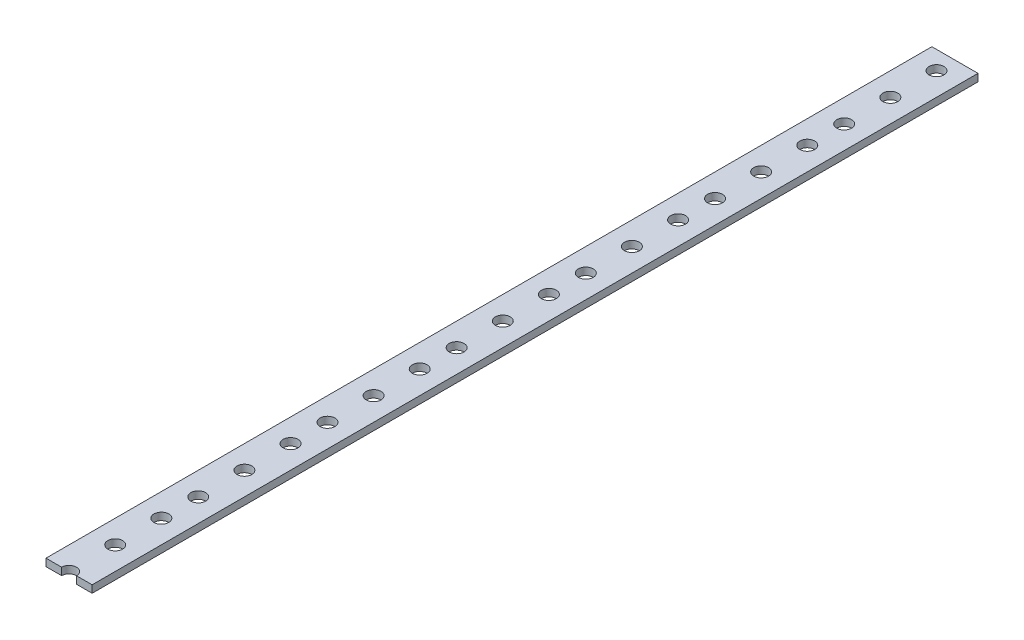
ISO-10303-21;
HEADER;
FILE_DESCRIPTION(('STEP AP214'),'2;1');
FILE_NAME('part.step','',(''),(''),'','','');
FILE_SCHEMA(('AUTOMOTIVE_DESIGN { 1 0 10303 214 1 1 1 1 }'));
ENDSEC;
DATA;
#1=APPLICATION_CONTEXT('core data for automotive mechanical design processes');
#2=APPLICATION_PROTOCOL_DEFINITION('international standard','automotive_design',2000,#1);
#3=PRODUCT_CONTEXT('',#1,'mechanical');
#4=PRODUCT('Part','Part','',(#3));
#5=PRODUCT_RELATED_PRODUCT_CATEGORY('part','',(#4));
#6=PRODUCT_DEFINITION_FORMATION('','',#4);
#7=PRODUCT_DEFINITION_CONTEXT('part definition',#1,'design');
#8=PRODUCT_DEFINITION('design','',#6,#7);
#9=PRODUCT_DEFINITION_SHAPE('','',#8);
#10=(LENGTH_UNIT() NAMED_UNIT(*) SI_UNIT(.MILLI.,.METRE.));
#11=(NAMED_UNIT(*) PLANE_ANGLE_UNIT() SI_UNIT($,.RADIAN.));
#12=(NAMED_UNIT(*) SI_UNIT($,.STERADIAN.) SOLID_ANGLE_UNIT());
#13=UNCERTAINTY_MEASURE_WITH_UNIT(LENGTH_MEASURE(1.E-05),#10,'distance_accuracy_value','');
#14=(GEOMETRIC_REPRESENTATION_CONTEXT(3) GLOBAL_UNCERTAINTY_ASSIGNED_CONTEXT((#13)) GLOBAL_UNIT_ASSIGNED_CONTEXT((#10,
#11,#12)) REPRESENTATION_CONTEXT('',''));
#15=CARTESIAN_POINT('',(0.,0.,0.));
#16=DIRECTION('',(0.,0.,1.));
#17=DIRECTION('',(1.,0.,0.));
#18=AXIS2_PLACEMENT_3D('',#15,#16,#17);
#19=CARTESIAN_POINT('',(-7.9375,2.54,152.4));
#20=DIRECTION('',(0.,0.,-1.));
#21=DIRECTION('',(-1.,0.,0.));
#22=AXIS2_PLACEMENT_3D('',#19,#20,#21);
#23=PLANE('',#22);
#24=DIRECTION('',(1.,0.,0.));
#25=VECTOR('',#24,1.);
#26=CARTESIAN_POINT('',(-7.9375,0.,152.4));
#27=LINE('',#26,#25);
#28=CARTESIAN_POINT('',(-7.9375,0.,152.4));
#29=VERTEX_POINT('',#28);
#30=CARTESIAN_POINT('',(-2.55270000000001,0.,152.4));
#31=VERTEX_POINT('',#30);
#32=EDGE_CURVE('E125',#29,#31,#27,.T.);
#33=ORIENTED_EDGE('',*,*,#32,.T.);
#34=DIRECTION('',(0.,1.,0.));
#35=VECTOR('',#34,1.);
#36=CARTESIAN_POINT('',(-2.55270000000001,0.,152.4));
#37=LINE('',#36,#35);
#38=CARTESIAN_POINT('',(-2.55270000000001,2.54,152.4));
#39=VERTEX_POINT('',#38);
#40=EDGE_CURVE('E59',#31,#39,#37,.T.);
#41=ORIENTED_EDGE('',*,*,#40,.T.);
#42=DIRECTION('',(1.,0.,0.));
#43=VECTOR('',#42,1.);
#44=CARTESIAN_POINT('',(-7.9375,2.54,152.4));
#45=LINE('',#44,#43);
#46=CARTESIAN_POINT('',(-7.9375,2.54,152.4));
#47=VERTEX_POINT('',#46);
#48=EDGE_CURVE('E139',#47,#39,#45,.T.);
#49=ORIENTED_EDGE('',*,*,#48,.F.);
#50=DIRECTION('',(0.,-1.,0.));
#51=VECTOR('',#50,1.);
#52=CARTESIAN_POINT('',(-7.9375,2.54,152.4));
#53=LINE('',#52,#51);
#54=EDGE_CURVE('E138',#47,#29,#53,.T.);
#55=ORIENTED_EDGE('',*,*,#54,.T.);
#56=EDGE_LOOP('',(#33,#41,#49,#55));
#57=FACE_BOUND('',#56,.T.);
#58=ADVANCED_FACE('F43',(#57),#23,.F.);
#59=CARTESIAN_POINT('',(0.,0.,-114.3));
#60=DIRECTION('',(0.,1.,0.));
#61=DIRECTION('',(0.,0.,1.));
#62=AXIS2_PLACEMENT_3D('',#59,#60,#61);
#63=CYLINDRICAL_SURFACE('',#62,2.55270000000001);
#64=CARTESIAN_POINT('',(0.,0.,-114.3));
#65=DIRECTION('',(0.,1.,0.));
#66=DIRECTION('',(0.,0.,1.));
#67=AXIS2_PLACEMENT_3D('',#64,#65,#66);
#68=CIRCLE('',#67,2.55270000000001);
#69=CARTESIAN_POINT('',(0.,0.,-111.7473));
#70=VERTEX_POINT('',#69);
#71=EDGE_CURVE('E52',#70,#70,#68,.T.);
#72=ORIENTED_EDGE('',*,*,#71,.F.);
#73=EDGE_LOOP('',(#72));
#74=FACE_BOUND('',#73,.T.);
#75=CARTESIAN_POINT('',(0.,2.54,-114.3));
#76=DIRECTION('',(0.,1.,0.));
#77=DIRECTION('',(0.,0.,1.));
#78=AXIS2_PLACEMENT_3D('',#75,#76,#77);
#79=CIRCLE('',#78,2.55270000000001);
#80=CARTESIAN_POINT('',(0.,2.54,-111.7473));
#81=VERTEX_POINT('',#80);
#82=EDGE_CURVE('E11',#81,#81,#79,.T.);
#83=ORIENTED_EDGE('',*,*,#82,.T.);
#84=EDGE_LOOP('',(#83));
#85=FACE_BOUND('',#84,.T.);
#86=ADVANCED_FACE('F45',(#74,#85),#63,.F.);
#87=CARTESIAN_POINT('',(7.9375,2.54,152.4));
#88=DIRECTION('',(-1.,0.,0.));
#89=DIRECTION('',(0.,0.,1.));
#90=AXIS2_PLACEMENT_3D('',#87,#88,#89);
#91=PLANE('',#90);
#92=DIRECTION('',(0.,0.,-1.));
#93=VECTOR('',#92,1.);
#94=CARTESIAN_POINT('',(7.9375,0.,152.4));
#95=LINE('',#94,#93);
#96=CARTESIAN_POINT('',(7.9375,0.,152.4));
#97=VERTEX_POINT('',#96);
#98=CARTESIAN_POINT('',(7.9375,0.,-152.4));
#99=VERTEX_POINT('',#98);
#100=EDGE_CURVE('E123',#97,#99,#95,.T.);
#101=ORIENTED_EDGE('',*,*,#100,.T.);
#102=DIRECTION('',(0.,-1.,0.));
#103=VECTOR('',#102,1.);
#104=CARTESIAN_POINT('',(7.9375,2.54,-152.4));
#105=LINE('',#104,#103);
#106=CARTESIAN_POINT('',(7.9375,2.54,-152.4));
#107=VERTEX_POINT('',#106);
#108=EDGE_CURVE('E147',#107,#99,#105,.T.);
#109=ORIENTED_EDGE('',*,*,#108,.F.);
#110=DIRECTION('',(0.,0.,-1.));
#111=VECTOR('',#110,1.);
#112=CARTESIAN_POINT('',(7.9375,2.54,152.4));
#113=LINE('',#112,#111);
#114=CARTESIAN_POINT('',(7.9375,2.54,152.4));
#115=VERTEX_POINT('',#114);
#116=EDGE_CURVE('E130',#115,#107,#113,.T.);
#117=ORIENTED_EDGE('',*,*,#116,.F.);
#118=DIRECTION('',(0.,-1.,0.));
#119=VECTOR('',#118,1.);
#120=CARTESIAN_POINT('',(7.9375,2.54,152.4));
#121=LINE('',#120,#119);
#122=EDGE_CURVE('E135',#115,#97,#121,.T.);
#123=ORIENTED_EDGE('',*,*,#122,.T.);
#124=EDGE_LOOP('',(#101,#109,#117,#123));
#125=FACE_BOUND('',#124,.T.);
#126=ADVANCED_FACE('F156',(#125),#91,.F.);
#127=CARTESIAN_POINT('',(-7.9375,2.54,-152.4));
#128=DIRECTION('',(0.,0.,1.));
#129=DIRECTION('',(1.,0.,0.));
#130=AXIS2_PLACEMENT_3D('',#127,#128,#129);
#131=PLANE('',#130);
#132=DIRECTION('',(-1.,0.,0.));
#133=VECTOR('',#132,1.);
#134=CARTESIAN_POINT('',(-7.9375,0.,-152.4));
#135=LINE('',#134,#133);
#136=CARTESIAN_POINT('',(-7.9375,0.,-152.4));
#137=VERTEX_POINT('',#136);
#138=EDGE_CURVE('E131',#99,#137,#135,.T.);
#139=ORIENTED_EDGE('',*,*,#138,.T.);
#140=DIRECTION('',(0.,-1.,0.));
#141=VECTOR('',#140,1.);
#142=CARTESIAN_POINT('',(-7.9375,2.54,-152.4));
#143=LINE('',#142,#141);
#144=CARTESIAN_POINT('',(-7.9375,2.54,-152.4));
#145=VERTEX_POINT('',#144);
#146=EDGE_CURVE('E143',#145,#137,#143,.T.);
#147=ORIENTED_EDGE('',*,*,#146,.F.);
#148=DIRECTION('',(-1.,0.,0.));
#149=VECTOR('',#148,1.);
#150=CARTESIAN_POINT('',(-7.9375,2.54,-152.4));
#151=LINE('',#150,#149);
#152=EDGE_CURVE('E98',#107,#145,#151,.T.);
#153=ORIENTED_EDGE('',*,*,#152,.F.);
#154=ORIENTED_EDGE('',*,*,#108,.T.);
#155=EDGE_LOOP('',(#139,#147,#153,#154));
#156=FACE_BOUND('',#155,.T.);
#157=ADVANCED_FACE('F182',(#156),#131,.F.);
#158=CARTESIAN_POINT('',(-7.9375,2.54,152.4));
#159=DIRECTION('',(1.,0.,0.));
#160=DIRECTION('',(0.,0.,-1.));
#161=AXIS2_PLACEMENT_3D('',#158,#159,#160);
#162=PLANE('',#161);
#163=DIRECTION('',(0.,0.,1.));
#164=VECTOR('',#163,1.);
#165=CARTESIAN_POINT('',(-7.9375,0.,152.4));
#166=LINE('',#165,#164);
#167=EDGE_CURVE('E126',#137,#29,#166,.T.);
#168=ORIENTED_EDGE('',*,*,#167,.T.);
#169=ORIENTED_EDGE('',*,*,#54,.F.);
#170=DIRECTION('',(0.,0.,1.));
#171=VECTOR('',#170,1.);
#172=CARTESIAN_POINT('',(-7.9375,2.54,152.4));
#173=LINE('',#172,#171);
#174=EDGE_CURVE('E203',#145,#47,#173,.T.);
#175=ORIENTED_EDGE('',*,*,#174,.F.);
#176=ORIENTED_EDGE('',*,*,#146,.T.);
#177=EDGE_LOOP('',(#168,#169,#175,#176));
#178=FACE_BOUND('',#177,.T.);
#179=ADVANCED_FACE('F170',(#178),#162,.F.);
#180=CARTESIAN_POINT('',(2.55270000000001,2.54,152.4));
#181=VERTEX_POINT('',#180);
#182=EDGE_CURVE('E68',#181,#115,#45,.T.);
#183=ORIENTED_EDGE('',*,*,#182,.F.);
#184=DIRECTION('',(0.,1.,0.));
#185=VECTOR('',#184,1.);
#186=CARTESIAN_POINT('',(2.55270000000001,0.,152.4));
#187=LINE('',#186,#185);
#188=CARTESIAN_POINT('',(2.55270000000001,0.,152.4));
#189=VERTEX_POINT('',#188);
#190=EDGE_CURVE('E107',#181,#189,#187,.F.);
#191=ORIENTED_EDGE('',*,*,#190,.T.);
#192=EDGE_CURVE('E90',#189,#97,#27,.T.);
#193=ORIENTED_EDGE('',*,*,#192,.T.);
#194=ORIENTED_EDGE('',*,*,#122,.F.);
#195=EDGE_LOOP('',(#183,#191,#193,#194));
#196=FACE_BOUND('',#195,.T.);
#197=ADVANCED_FACE('F115',(#196),#23,.F.);
#198=CARTESIAN_POINT('',(0.,2.54,0.));
#199=DIRECTION('',(0.,-1.,0.));
#200=DIRECTION('',(0.,0.,-1.));
#201=AXIS2_PLACEMENT_3D('',#198,#199,#200);
#202=PLANE('',#201);
#203=CARTESIAN_POINT('',(0.,2.54,120.65));
#204=DIRECTION('',(0.,1.,0.));
#205=DIRECTION('',(0.,0.,1.));
#206=AXIS2_PLACEMENT_3D('',#203,#204,#205);
#207=CIRCLE('',#206,2.55270000000001);
#208=CARTESIAN_POINT('',(0.,2.54,123.2027));
#209=VERTEX_POINT('',#208);
#210=EDGE_CURVE('E352',#209,#209,#207,.T.);
#211=ORIENTED_EDGE('',*,*,#210,.F.);
#212=EDGE_LOOP('',(#211));
#213=FACE_BOUND('',#212,.T.);
#214=CARTESIAN_POINT('',(0.,2.54,136.525));
#215=DIRECTION('',(0.,1.,0.));
#216=DIRECTION('',(0.,0.,1.));
#217=AXIS2_PLACEMENT_3D('',#214,#215,#216);
#218=CIRCLE('',#217,2.55270000000001);
#219=CARTESIAN_POINT('',(0.,2.54,139.0777));
#220=VERTEX_POINT('',#219);
#221=EDGE_CURVE('E112',#220,#220,#218,.T.);
#222=ORIENTED_EDGE('',*,*,#221,.F.);
#223=EDGE_LOOP('',(#222));
#224=FACE_BOUND('',#223,.T.);
#225=CARTESIAN_POINT('',(0.,2.54,76.2));
#226=DIRECTION('',(0.,1.,0.));
#227=DIRECTION('',(0.,0.,1.));
#228=AXIS2_PLACEMENT_3D('',#225,#226,#227);
#229=CIRCLE('',#228,2.55270000000001);
#230=CARTESIAN_POINT('',(0.,2.54,78.7527));
#231=VERTEX_POINT('',#230);
#232=EDGE_CURVE('E334',#231,#231,#229,.T.);
#233=ORIENTED_EDGE('',*,*,#232,.F.);
#234=EDGE_LOOP('',(#233));
#235=FACE_BOUND('',#234,.T.);
#236=CARTESIAN_POINT('',(0.,2.54,92.075));
#237=DIRECTION('',(0.,1.,0.));
#238=DIRECTION('',(0.,0.,1.));
#239=AXIS2_PLACEMENT_3D('',#236,#237,#238);
#240=CIRCLE('',#239,2.55270000000001);
#241=CARTESIAN_POINT('',(0.,2.54,94.6277));
#242=VERTEX_POINT('',#241);
#243=EDGE_CURVE('E326',#242,#242,#240,.T.);
#244=ORIENTED_EDGE('',*,*,#243,.F.);
#245=EDGE_LOOP('',(#244));
#246=FACE_BOUND('',#245,.T.);
#247=CARTESIAN_POINT('',(0.,2.54,107.95));
#248=DIRECTION('',(0.,1.,0.));
#249=DIRECTION('',(0.,0.,1.));
#250=AXIS2_PLACEMENT_3D('',#247,#248,#249);
#251=CIRCLE('',#250,2.55270000000001);
#252=CARTESIAN_POINT('',(0.,2.54,110.5027));
#253=VERTEX_POINT('',#252);
#254=EDGE_CURVE('E318',#253,#253,#251,.T.);
#255=ORIENTED_EDGE('',*,*,#254,.F.);
#256=EDGE_LOOP('',(#255));
#257=FACE_BOUND('',#256,.T.);
#258=CARTESIAN_POINT('',(0.,2.54,31.75));
#259=DIRECTION('',(0.,1.,0.));
#260=DIRECTION('',(0.,0.,1.));
#261=AXIS2_PLACEMENT_3D('',#258,#259,#260);
#262=CIRCLE('',#261,2.55270000000001);
#263=CARTESIAN_POINT('',(0.,2.54,34.3027));
#264=VERTEX_POINT('',#263);
#265=EDGE_CURVE('E311',#264,#264,#262,.T.);
#266=ORIENTED_EDGE('',*,*,#265,.F.);
#267=EDGE_LOOP('',(#266));
#268=FACE_BOUND('',#267,.T.);
#269=CARTESIAN_POINT('',(0.,2.54,47.625));
#270=DIRECTION('',(0.,1.,0.));
#271=DIRECTION('',(0.,0.,1.));
#272=AXIS2_PLACEMENT_3D('',#269,#270,#271);
#273=CIRCLE('',#272,2.55270000000001);
#274=CARTESIAN_POINT('',(0.,2.54,50.1777));
#275=VERTEX_POINT('',#274);
#276=EDGE_CURVE('E303',#275,#275,#273,.T.);
#277=ORIENTED_EDGE('',*,*,#276,.F.);
#278=EDGE_LOOP('',(#277));
#279=FACE_BOUND('',#278,.T.);
#280=CARTESIAN_POINT('',(0.,2.54,63.5));
#281=DIRECTION('',(0.,1.,0.));
#282=DIRECTION('',(0.,0.,1.));
#283=AXIS2_PLACEMENT_3D('',#280,#281,#282);
#284=CIRCLE('',#283,2.55270000000001);
#285=CARTESIAN_POINT('',(0.,2.54,66.0527));
#286=VERTEX_POINT('',#285);
#287=EDGE_CURVE('E294',#286,#286,#284,.T.);
#288=ORIENTED_EDGE('',*,*,#287,.F.);
#289=EDGE_LOOP('',(#288));
#290=FACE_BOUND('',#289,.T.);
#291=CARTESIAN_POINT('',(0.,2.54,-12.7));
#292=DIRECTION('',(0.,1.,0.));
#293=DIRECTION('',(0.,0.,1.));
#294=AXIS2_PLACEMENT_3D('',#291,#292,#293);
#295=CIRCLE('',#294,2.55270000000001);
#296=CARTESIAN_POINT('',(0.,2.54,-10.1473));
#297=VERTEX_POINT('',#296);
#298=EDGE_CURVE('E287',#297,#297,#295,.T.);
#299=ORIENTED_EDGE('',*,*,#298,.F.);
#300=EDGE_LOOP('',(#299));
#301=FACE_BOUND('',#300,.T.);
#302=CARTESIAN_POINT('',(0.,2.54,3.17500000000001));
#303=DIRECTION('',(0.,1.,0.));
#304=DIRECTION('',(0.,0.,1.));
#305=AXIS2_PLACEMENT_3D('',#302,#303,#304);
#306=CIRCLE('',#305,2.55270000000001);
#307=CARTESIAN_POINT('',(0.,2.54,5.72770000000002));
#308=VERTEX_POINT('',#307);
#309=EDGE_CURVE('E279',#308,#308,#306,.T.);
#310=ORIENTED_EDGE('',*,*,#309,.F.);
#311=EDGE_LOOP('',(#310));
#312=FACE_BOUND('',#311,.T.);
#313=CARTESIAN_POINT('',(0.,2.54,19.05));
#314=DIRECTION('',(0.,1.,0.));
#315=DIRECTION('',(0.,0.,1.));
#316=AXIS2_PLACEMENT_3D('',#313,#314,#315);
#317=CIRCLE('',#316,2.55270000000001);
#318=CARTESIAN_POINT('',(0.,2.54,21.6027));
#319=VERTEX_POINT('',#318);
#320=EDGE_CURVE('E270',#319,#319,#317,.T.);
#321=ORIENTED_EDGE('',*,*,#320,.F.);
#322=EDGE_LOOP('',(#321));
#323=FACE_BOUND('',#322,.T.);
#324=CARTESIAN_POINT('',(0.,2.54,-57.15));
#325=DIRECTION('',(0.,1.,0.));
#326=DIRECTION('',(0.,0.,1.));
#327=AXIS2_PLACEMENT_3D('',#324,#325,#326);
#328=CIRCLE('',#327,2.55270000000001);
#329=CARTESIAN_POINT('',(0.,2.54,-54.5973));
#330=VERTEX_POINT('',#329);
#331=EDGE_CURVE('E263',#330,#330,#328,.T.);
#332=ORIENTED_EDGE('',*,*,#331,.F.);
#333=EDGE_LOOP('',(#332));
#334=FACE_BOUND('',#333,.T.);
#335=CARTESIAN_POINT('',(0.,2.54,-41.275));
#336=DIRECTION('',(0.,1.,0.));
#337=DIRECTION('',(0.,0.,1.));
#338=AXIS2_PLACEMENT_3D('',#335,#336,#337);
#339=CIRCLE('',#338,2.55270000000001);
#340=CARTESIAN_POINT('',(0.,2.54,-38.7223));
#341=VERTEX_POINT('',#340);
#342=EDGE_CURVE('E255',#341,#341,#339,.T.);
#343=ORIENTED_EDGE('',*,*,#342,.F.);
#344=EDGE_LOOP('',(#343));
#345=FACE_BOUND('',#344,.T.);
#346=CARTESIAN_POINT('',(0.,2.54,-25.4));
#347=DIRECTION('',(0.,1.,0.));
#348=DIRECTION('',(0.,0.,1.));
#349=AXIS2_PLACEMENT_3D('',#346,#347,#348);
#350=CIRCLE('',#349,2.55270000000001);
#351=CARTESIAN_POINT('',(0.,2.54,-22.8473));
#352=VERTEX_POINT('',#351);
#353=EDGE_CURVE('E246',#352,#352,#350,.T.);
#354=ORIENTED_EDGE('',*,*,#353,.F.);
#355=EDGE_LOOP('',(#354));
#356=FACE_BOUND('',#355,.T.);
#357=CARTESIAN_POINT('',(0.,2.54,-101.6));
#358=DIRECTION('',(0.,1.,0.));
#359=DIRECTION('',(0.,0.,1.));
#360=AXIS2_PLACEMENT_3D('',#357,#358,#359);
#361=CIRCLE('',#360,2.55270000000001);
#362=CARTESIAN_POINT('',(0.,2.54,-99.0473));
#363=VERTEX_POINT('',#362);
#364=EDGE_CURVE('E239',#363,#363,#361,.T.);
#365=ORIENTED_EDGE('',*,*,#364,.F.);
#366=EDGE_LOOP('',(#365));
#367=FACE_BOUND('',#366,.T.);
#368=CARTESIAN_POINT('',(0.,2.54,-85.725));
#369=DIRECTION('',(0.,1.,0.));
#370=DIRECTION('',(0.,0.,1.));
#371=AXIS2_PLACEMENT_3D('',#368,#369,#370);
#372=CIRCLE('',#371,2.55270000000001);
#373=CARTESIAN_POINT('',(0.,2.54,-83.1723));
#374=VERTEX_POINT('',#373);
#375=EDGE_CURVE('E231',#374,#374,#372,.T.);
#376=ORIENTED_EDGE('',*,*,#375,.F.);
#377=EDGE_LOOP('',(#376));
#378=FACE_BOUND('',#377,.T.);
#379=CARTESIAN_POINT('',(0.,2.54,-69.85));
#380=DIRECTION('',(0.,1.,0.));
#381=DIRECTION('',(0.,0.,1.));
#382=AXIS2_PLACEMENT_3D('',#379,#380,#381);
#383=CIRCLE('',#382,2.55270000000001);
#384=CARTESIAN_POINT('',(0.,2.54,-67.2973));
#385=VERTEX_POINT('',#384);
#386=EDGE_CURVE('E222',#385,#385,#383,.T.);
#387=ORIENTED_EDGE('',*,*,#386,.F.);
#388=EDGE_LOOP('',(#387));
#389=FACE_BOUND('',#388,.T.);
#390=CARTESIAN_POINT('',(0.,2.54,-130.175));
#391=DIRECTION('',(0.,1.,0.));
#392=DIRECTION('',(0.,0.,1.));
#393=AXIS2_PLACEMENT_3D('',#390,#391,#392);
#394=CIRCLE('',#393,2.55270000000001);
#395=CARTESIAN_POINT('',(0.,2.54,-127.6223));
#396=VERTEX_POINT('',#395);
#397=EDGE_CURVE('E212',#396,#396,#394,.T.);
#398=ORIENTED_EDGE('',*,*,#397,.F.);
#399=EDGE_LOOP('',(#398));
#400=FACE_BOUND('',#399,.T.);
#401=CARTESIAN_POINT('',(0.,2.54,-146.05));
#402=DIRECTION('',(0.,1.,0.));
#403=DIRECTION('',(0.,0.,1.));
#404=AXIS2_PLACEMENT_3D('',#401,#402,#403);
#405=CIRCLE('',#404,2.55270000000001);
#406=CARTESIAN_POINT('',(0.,2.54,-143.4973));
#407=VERTEX_POINT('',#406);
#408=EDGE_CURVE('E197',#407,#407,#405,.T.);
#409=ORIENTED_EDGE('',*,*,#408,.F.);
#410=EDGE_LOOP('',(#409));
#411=FACE_BOUND('',#410,.T.);
#412=ORIENTED_EDGE('',*,*,#48,.T.);
#413=CARTESIAN_POINT('',(0.,2.54,152.4));
#414=DIRECTION('',(0.,1.,0.));
#415=DIRECTION('',(0.,0.,1.));
#416=AXIS2_PLACEMENT_3D('',#413,#414,#415);
#417=CIRCLE('',#416,2.55270000000001);
#418=EDGE_CURVE('E113',#181,#39,#417,.T.);
#419=ORIENTED_EDGE('',*,*,#418,.F.);
#420=ORIENTED_EDGE('',*,*,#182,.T.);
#421=ORIENTED_EDGE('',*,*,#116,.T.);
#422=ORIENTED_EDGE('',*,*,#152,.T.);
#423=ORIENTED_EDGE('',*,*,#174,.T.);
#424=EDGE_LOOP('',(#412,#419,#420,#421,#422,#423));
#425=FACE_BOUND('',#424,.T.);
#426=ORIENTED_EDGE('',*,*,#82,.F.);
#427=EDGE_LOOP('',(#426));
#428=FACE_BOUND('',#427,.T.);
#429=ADVANCED_FACE('F159',(#213,#224,#235,#246,#257,#268,#279,#290,#301,#312,#323,#334,#345,
#356,#367,#378,#389,#400,#411,#425,#428),#202,.F.);
#430=CARTESIAN_POINT('',(0.,0.,0.));
#431=DIRECTION('',(0.,-1.,0.));
#432=DIRECTION('',(0.,0.,-1.));
#433=AXIS2_PLACEMENT_3D('',#430,#431,#432);
#434=PLANE('',#433);
#435=CARTESIAN_POINT('',(0.,0.,120.65));
#436=DIRECTION('',(0.,1.,0.));
#437=DIRECTION('',(0.,0.,1.));
#438=AXIS2_PLACEMENT_3D('',#435,#436,#437);
#439=CIRCLE('',#438,2.55270000000001);
#440=CARTESIAN_POINT('',(0.,0.,123.2027));
#441=VERTEX_POINT('',#440);
#442=EDGE_CURVE('E117',#441,#441,#439,.T.);
#443=ORIENTED_EDGE('',*,*,#442,.T.);
#444=EDGE_LOOP('',(#443));
#445=FACE_BOUND('',#444,.T.);
#446=CARTESIAN_POINT('',(0.,0.,136.525));
#447=DIRECTION('',(0.,1.,0.));
#448=DIRECTION('',(0.,0.,1.));
#449=AXIS2_PLACEMENT_3D('',#446,#447,#448);
#450=CIRCLE('',#449,2.55270000000001);
#451=CARTESIAN_POINT('',(0.,0.,139.0777));
#452=VERTEX_POINT('',#451);
#453=EDGE_CURVE('E348',#452,#452,#450,.T.);
#454=ORIENTED_EDGE('',*,*,#453,.T.);
#455=EDGE_LOOP('',(#454));
#456=FACE_BOUND('',#455,.T.);
#457=CARTESIAN_POINT('',(0.,0.,152.4));
#458=DIRECTION('',(0.,1.,0.));
#459=DIRECTION('',(0.,0.,1.));
#460=AXIS2_PLACEMENT_3D('',#457,#458,#459);
#461=CIRCLE('',#460,2.55270000000001);
#462=EDGE_CURVE('E105',#189,#31,#461,.T.);
#463=ORIENTED_EDGE('',*,*,#462,.T.);
#464=ORIENTED_EDGE('',*,*,#32,.F.);
#465=ORIENTED_EDGE('',*,*,#167,.F.);
#466=ORIENTED_EDGE('',*,*,#138,.F.);
#467=ORIENTED_EDGE('',*,*,#100,.F.);
#468=ORIENTED_EDGE('',*,*,#192,.F.);
#469=EDGE_LOOP('',(#463,#464,#465,#466,#467,#468));
#470=FACE_BOUND('',#469,.T.);
#471=CARTESIAN_POINT('',(0.,0.,76.2));
#472=DIRECTION('',(0.,1.,0.));
#473=DIRECTION('',(0.,0.,1.));
#474=AXIS2_PLACEMENT_3D('',#471,#472,#473);
#475=CIRCLE('',#474,2.55270000000001);
#476=CARTESIAN_POINT('',(0.,0.,78.7527));
#477=VERTEX_POINT('',#476);
#478=EDGE_CURVE('E299',#477,#477,#475,.T.);
#479=ORIENTED_EDGE('',*,*,#478,.T.);
#480=EDGE_LOOP('',(#479));
#481=FACE_BOUND('',#480,.T.);
#482=CARTESIAN_POINT('',(0.,0.,92.075));
#483=DIRECTION('',(0.,1.,0.));
#484=DIRECTION('',(0.,0.,1.));
#485=AXIS2_PLACEMENT_3D('',#482,#483,#484);
#486=CIRCLE('',#485,2.55270000000001);
#487=CARTESIAN_POINT('',(0.,0.,94.6277));
#488=VERTEX_POINT('',#487);
#489=EDGE_CURVE('E330',#488,#488,#486,.T.);
#490=ORIENTED_EDGE('',*,*,#489,.T.);
#491=EDGE_LOOP('',(#490));
#492=FACE_BOUND('',#491,.T.);
#493=CARTESIAN_POINT('',(0.,0.,107.95));
#494=DIRECTION('',(0.,1.,0.));
#495=DIRECTION('',(0.,0.,1.));
#496=AXIS2_PLACEMENT_3D('',#493,#494,#495);
#497=CIRCLE('',#496,2.55270000000001);
#498=CARTESIAN_POINT('',(0.,0.,110.5027));
#499=VERTEX_POINT('',#498);
#500=EDGE_CURVE('E322',#499,#499,#497,.T.);
#501=ORIENTED_EDGE('',*,*,#500,.T.);
#502=EDGE_LOOP('',(#501));
#503=FACE_BOUND('',#502,.T.);
#504=CARTESIAN_POINT('',(0.,0.,31.75));
#505=DIRECTION('',(0.,1.,0.));
#506=DIRECTION('',(0.,0.,1.));
#507=AXIS2_PLACEMENT_3D('',#504,#505,#506);
#508=CIRCLE('',#507,2.55270000000001);
#509=CARTESIAN_POINT('',(0.,0.,34.3027));
#510=VERTEX_POINT('',#509);
#511=EDGE_CURVE('E275',#510,#510,#508,.T.);
#512=ORIENTED_EDGE('',*,*,#511,.T.);
#513=EDGE_LOOP('',(#512));
#514=FACE_BOUND('',#513,.T.);
#515=CARTESIAN_POINT('',(0.,0.,47.625));
#516=DIRECTION('',(0.,1.,0.));
#517=DIRECTION('',(0.,0.,1.));
#518=AXIS2_PLACEMENT_3D('',#515,#516,#517);
#519=CIRCLE('',#518,2.55270000000001);
#520=CARTESIAN_POINT('',(0.,0.,50.1777));
#521=VERTEX_POINT('',#520);
#522=EDGE_CURVE('E307',#521,#521,#519,.T.);
#523=ORIENTED_EDGE('',*,*,#522,.T.);
#524=EDGE_LOOP('',(#523));
#525=FACE_BOUND('',#524,.T.);
#526=CARTESIAN_POINT('',(0.,0.,63.5));
#527=DIRECTION('',(0.,1.,0.));
#528=DIRECTION('',(0.,0.,1.));
#529=AXIS2_PLACEMENT_3D('',#526,#527,#528);
#530=CIRCLE('',#529,2.55270000000001);
#531=CARTESIAN_POINT('',(0.,0.,66.0527));
#532=VERTEX_POINT('',#531);
#533=EDGE_CURVE('E298',#532,#532,#530,.T.);
#534=ORIENTED_EDGE('',*,*,#533,.T.);
#535=EDGE_LOOP('',(#534));
#536=FACE_BOUND('',#535,.T.);
#537=CARTESIAN_POINT('',(0.,0.,-12.7));
#538=DIRECTION('',(0.,1.,0.));
#539=DIRECTION('',(0.,0.,1.));
#540=AXIS2_PLACEMENT_3D('',#537,#538,#539);
#541=CIRCLE('',#540,2.55270000000001);
#542=CARTESIAN_POINT('',(0.,0.,-10.1473));
#543=VERTEX_POINT('',#542);
#544=EDGE_CURVE('E251',#543,#543,#541,.T.);
#545=ORIENTED_EDGE('',*,*,#544,.T.);
#546=EDGE_LOOP('',(#545));
#547=FACE_BOUND('',#546,.T.);
#548=CARTESIAN_POINT('',(0.,0.,3.17500000000001));
#549=DIRECTION('',(0.,1.,0.));
#550=DIRECTION('',(0.,0.,1.));
#551=AXIS2_PLACEMENT_3D('',#548,#549,#550);
#552=CIRCLE('',#551,2.55270000000001);
#553=CARTESIAN_POINT('',(0.,0.,5.72770000000002));
#554=VERTEX_POINT('',#553);
#555=EDGE_CURVE('E283',#554,#554,#552,.T.);
#556=ORIENTED_EDGE('',*,*,#555,.T.);
#557=EDGE_LOOP('',(#556));
#558=FACE_BOUND('',#557,.T.);
#559=CARTESIAN_POINT('',(0.,0.,19.05));
#560=DIRECTION('',(0.,1.,0.));
#561=DIRECTION('',(0.,0.,1.));
#562=AXIS2_PLACEMENT_3D('',#559,#560,#561);
#563=CIRCLE('',#562,2.55270000000001);
#564=CARTESIAN_POINT('',(0.,0.,21.6027));
#565=VERTEX_POINT('',#564);
#566=EDGE_CURVE('E274',#565,#565,#563,.T.);
#567=ORIENTED_EDGE('',*,*,#566,.T.);
#568=EDGE_LOOP('',(#567));
#569=FACE_BOUND('',#568,.T.);
#570=CARTESIAN_POINT('',(0.,0.,-57.15));
#571=DIRECTION('',(0.,1.,0.));
#572=DIRECTION('',(0.,0.,1.));
#573=AXIS2_PLACEMENT_3D('',#570,#571,#572);
#574=CIRCLE('',#573,2.55270000000001);
#575=CARTESIAN_POINT('',(0.,0.,-54.5973));
#576=VERTEX_POINT('',#575);
#577=EDGE_CURVE('E227',#576,#576,#574,.T.);
#578=ORIENTED_EDGE('',*,*,#577,.T.);
#579=EDGE_LOOP('',(#578));
#580=FACE_BOUND('',#579,.T.);
#581=CARTESIAN_POINT('',(0.,0.,-41.275));
#582=DIRECTION('',(0.,1.,0.));
#583=DIRECTION('',(0.,0.,1.));
#584=AXIS2_PLACEMENT_3D('',#581,#582,#583);
#585=CIRCLE('',#584,2.55270000000001);
#586=CARTESIAN_POINT('',(0.,0.,-38.7223));
#587=VERTEX_POINT('',#586);
#588=EDGE_CURVE('E259',#587,#587,#585,.T.);
#589=ORIENTED_EDGE('',*,*,#588,.T.);
#590=EDGE_LOOP('',(#589));
#591=FACE_BOUND('',#590,.T.);
#592=CARTESIAN_POINT('',(0.,0.,-25.4));
#593=DIRECTION('',(0.,1.,0.));
#594=DIRECTION('',(0.,0.,1.));
#595=AXIS2_PLACEMENT_3D('',#592,#593,#594);
#596=CIRCLE('',#595,2.55270000000001);
#597=CARTESIAN_POINT('',(0.,0.,-22.8473));
#598=VERTEX_POINT('',#597);
#599=EDGE_CURVE('E250',#598,#598,#596,.T.);
#600=ORIENTED_EDGE('',*,*,#599,.T.);
#601=EDGE_LOOP('',(#600));
#602=FACE_BOUND('',#601,.T.);
#603=CARTESIAN_POINT('',(0.,0.,-101.6));
#604=DIRECTION('',(0.,1.,0.));
#605=DIRECTION('',(0.,0.,1.));
#606=AXIS2_PLACEMENT_3D('',#603,#604,#605);
#607=CIRCLE('',#606,2.55270000000001);
#608=CARTESIAN_POINT('',(0.,0.,-99.0473));
#609=VERTEX_POINT('',#608);
#610=EDGE_CURVE('E221',#609,#609,#607,.T.);
#611=ORIENTED_EDGE('',*,*,#610,.T.);
#612=EDGE_LOOP('',(#611));
#613=FACE_BOUND('',#612,.T.);
#614=CARTESIAN_POINT('',(0.,0.,-85.725));
#615=DIRECTION('',(0.,1.,0.));
#616=DIRECTION('',(0.,0.,1.));
#617=AXIS2_PLACEMENT_3D('',#614,#615,#616);
#618=CIRCLE('',#617,2.55270000000001);
#619=CARTESIAN_POINT('',(0.,0.,-83.1723));
#620=VERTEX_POINT('',#619);
#621=EDGE_CURVE('E235',#620,#620,#618,.T.);
#622=ORIENTED_EDGE('',*,*,#621,.T.);
#623=EDGE_LOOP('',(#622));
#624=FACE_BOUND('',#623,.T.);
#625=CARTESIAN_POINT('',(0.,0.,-69.85));
#626=DIRECTION('',(0.,1.,0.));
#627=DIRECTION('',(0.,0.,1.));
#628=AXIS2_PLACEMENT_3D('',#625,#626,#627);
#629=CIRCLE('',#628,2.55270000000001);
#630=CARTESIAN_POINT('',(0.,0.,-67.2973));
#631=VERTEX_POINT('',#630);
#632=EDGE_CURVE('E226',#631,#631,#629,.T.);
#633=ORIENTED_EDGE('',*,*,#632,.T.);
#634=EDGE_LOOP('',(#633));
#635=FACE_BOUND('',#634,.T.);
#636=CARTESIAN_POINT('',(0.,0.,-130.175));
#637=DIRECTION('',(0.,1.,0.));
#638=DIRECTION('',(0.,0.,1.));
#639=AXIS2_PLACEMENT_3D('',#636,#637,#638);
#640=CIRCLE('',#639,2.55270000000001);
#641=CARTESIAN_POINT('',(0.,0.,-127.6223));
#642=VERTEX_POINT('',#641);
#643=EDGE_CURVE('E217',#642,#642,#640,.T.);
#644=ORIENTED_EDGE('',*,*,#643,.T.);
#645=EDGE_LOOP('',(#644));
#646=FACE_BOUND('',#645,.T.);
#647=CARTESIAN_POINT('',(0.,0.,-146.05));
#648=DIRECTION('',(0.,1.,0.));
#649=DIRECTION('',(0.,0.,1.));
#650=AXIS2_PLACEMENT_3D('',#647,#648,#649);
#651=CIRCLE('',#650,2.55270000000001);
#652=CARTESIAN_POINT('',(0.,0.,-143.4973));
#653=VERTEX_POINT('',#652);
#654=EDGE_CURVE('E192',#653,#653,#651,.T.);
#655=ORIENTED_EDGE('',*,*,#654,.T.);
#656=EDGE_LOOP('',(#655));
#657=FACE_BOUND('',#656,.T.);
#658=ORIENTED_EDGE('',*,*,#71,.T.);
#659=EDGE_LOOP('',(#658));
#660=FACE_BOUND('',#659,.T.);
#661=ADVANCED_FACE('F120',(#445,#456,#470,#481,#492,#503,#514,#525,#536,#547,#558,#569,#580,
#591,#602,#613,#624,#635,#646,#657,#660),#434,.T.);
#662=CARTESIAN_POINT('',(0.,0.,-146.05));
#663=DIRECTION('',(0.,1.,0.));
#664=DIRECTION('',(0.,0.,1.));
#665=AXIS2_PLACEMENT_3D('',#662,#663,#664);
#666=CYLINDRICAL_SURFACE('',#665,2.55270000000001);
#667=ORIENTED_EDGE('',*,*,#654,.F.);
#668=EDGE_LOOP('',(#667));
#669=FACE_BOUND('',#668,.T.);
#670=ORIENTED_EDGE('',*,*,#408,.T.);
#671=EDGE_LOOP('',(#670));
#672=FACE_BOUND('',#671,.T.);
#673=ADVANCED_FACE('F167',(#669,#672),#666,.F.);
#674=CARTESIAN_POINT('',(0.,0.,-130.175));
#675=DIRECTION('',(0.,1.,0.));
#676=DIRECTION('',(0.,0.,1.));
#677=AXIS2_PLACEMENT_3D('',#674,#675,#676);
#678=CYLINDRICAL_SURFACE('',#677,2.55270000000001);
#679=ORIENTED_EDGE('',*,*,#643,.F.);
#680=EDGE_LOOP('',(#679));
#681=FACE_BOUND('',#680,.T.);
#682=ORIENTED_EDGE('',*,*,#397,.T.);
#683=EDGE_LOOP('',(#682));
#684=FACE_BOUND('',#683,.T.);
#685=ADVANCED_FACE('F433',(#681,#684),#678,.F.);
#686=CARTESIAN_POINT('',(0.,0.,-69.85));
#687=DIRECTION('',(0.,1.,0.));
#688=DIRECTION('',(0.,0.,1.));
#689=AXIS2_PLACEMENT_3D('',#686,#687,#688);
#690=CYLINDRICAL_SURFACE('',#689,2.55270000000001);
#691=ORIENTED_EDGE('',*,*,#632,.F.);
#692=EDGE_LOOP('',(#691));
#693=FACE_BOUND('',#692,.T.);
#694=ORIENTED_EDGE('',*,*,#386,.T.);
#695=EDGE_LOOP('',(#694));
#696=FACE_BOUND('',#695,.T.);
#697=ADVANCED_FACE('F429',(#693,#696),#690,.F.);
#698=CARTESIAN_POINT('',(0.,0.,-85.725));
#699=DIRECTION('',(0.,1.,0.));
#700=DIRECTION('',(0.,0.,1.));
#701=AXIS2_PLACEMENT_3D('',#698,#699,#700);
#702=CYLINDRICAL_SURFACE('',#701,2.55270000000001);
#703=ORIENTED_EDGE('',*,*,#621,.F.);
#704=EDGE_LOOP('',(#703));
#705=FACE_BOUND('',#704,.T.);
#706=ORIENTED_EDGE('',*,*,#375,.T.);
#707=EDGE_LOOP('',(#706));
#708=FACE_BOUND('',#707,.T.);
#709=ADVANCED_FACE('F425',(#705,#708),#702,.F.);
#710=CARTESIAN_POINT('',(0.,0.,-101.6));
#711=DIRECTION('',(0.,1.,0.));
#712=DIRECTION('',(0.,0.,1.));
#713=AXIS2_PLACEMENT_3D('',#710,#711,#712);
#714=CYLINDRICAL_SURFACE('',#713,2.55270000000001);
#715=ORIENTED_EDGE('',*,*,#610,.F.);
#716=EDGE_LOOP('',(#715));
#717=FACE_BOUND('',#716,.T.);
#718=ORIENTED_EDGE('',*,*,#364,.T.);
#719=EDGE_LOOP('',(#718));
#720=FACE_BOUND('',#719,.T.);
#721=ADVANCED_FACE('F421',(#717,#720),#714,.F.);
#722=CARTESIAN_POINT('',(0.,0.,-25.4));
#723=DIRECTION('',(0.,1.,0.));
#724=DIRECTION('',(0.,0.,1.));
#725=AXIS2_PLACEMENT_3D('',#722,#723,#724);
#726=CYLINDRICAL_SURFACE('',#725,2.55270000000001);
#727=ORIENTED_EDGE('',*,*,#599,.F.);
#728=EDGE_LOOP('',(#727));
#729=FACE_BOUND('',#728,.T.);
#730=ORIENTED_EDGE('',*,*,#353,.T.);
#731=EDGE_LOOP('',(#730));
#732=FACE_BOUND('',#731,.T.);
#733=ADVANCED_FACE('F417',(#729,#732),#726,.F.);
#734=CARTESIAN_POINT('',(0.,0.,-41.275));
#735=DIRECTION('',(0.,1.,0.));
#736=DIRECTION('',(0.,0.,1.));
#737=AXIS2_PLACEMENT_3D('',#734,#735,#736);
#738=CYLINDRICAL_SURFACE('',#737,2.55270000000001);
#739=ORIENTED_EDGE('',*,*,#588,.F.);
#740=EDGE_LOOP('',(#739));
#741=FACE_BOUND('',#740,.T.);
#742=ORIENTED_EDGE('',*,*,#342,.T.);
#743=EDGE_LOOP('',(#742));
#744=FACE_BOUND('',#743,.T.);
#745=ADVANCED_FACE('F413',(#741,#744),#738,.F.);
#746=CARTESIAN_POINT('',(0.,0.,-57.15));
#747=DIRECTION('',(0.,1.,0.));
#748=DIRECTION('',(0.,0.,1.));
#749=AXIS2_PLACEMENT_3D('',#746,#747,#748);
#750=CYLINDRICAL_SURFACE('',#749,2.55270000000001);
#751=ORIENTED_EDGE('',*,*,#577,.F.);
#752=EDGE_LOOP('',(#751));
#753=FACE_BOUND('',#752,.T.);
#754=ORIENTED_EDGE('',*,*,#331,.T.);
#755=EDGE_LOOP('',(#754));
#756=FACE_BOUND('',#755,.T.);
#757=ADVANCED_FACE('F409',(#753,#756),#750,.F.);
#758=CARTESIAN_POINT('',(0.,0.,19.05));
#759=DIRECTION('',(0.,1.,0.));
#760=DIRECTION('',(0.,0.,1.));
#761=AXIS2_PLACEMENT_3D('',#758,#759,#760);
#762=CYLINDRICAL_SURFACE('',#761,2.55270000000001);
#763=ORIENTED_EDGE('',*,*,#566,.F.);
#764=EDGE_LOOP('',(#763));
#765=FACE_BOUND('',#764,.T.);
#766=ORIENTED_EDGE('',*,*,#320,.T.);
#767=EDGE_LOOP('',(#766));
#768=FACE_BOUND('',#767,.T.);
#769=ADVANCED_FACE('F405',(#765,#768),#762,.F.);
#770=CARTESIAN_POINT('',(0.,0.,3.17500000000001));
#771=DIRECTION('',(0.,1.,0.));
#772=DIRECTION('',(0.,0.,1.));
#773=AXIS2_PLACEMENT_3D('',#770,#771,#772);
#774=CYLINDRICAL_SURFACE('',#773,2.55270000000001);
#775=ORIENTED_EDGE('',*,*,#555,.F.);
#776=EDGE_LOOP('',(#775));
#777=FACE_BOUND('',#776,.T.);
#778=ORIENTED_EDGE('',*,*,#309,.T.);
#779=EDGE_LOOP('',(#778));
#780=FACE_BOUND('',#779,.T.);
#781=ADVANCED_FACE('F401',(#777,#780),#774,.F.);
#782=CARTESIAN_POINT('',(0.,0.,-12.7));
#783=DIRECTION('',(0.,1.,0.));
#784=DIRECTION('',(0.,0.,1.));
#785=AXIS2_PLACEMENT_3D('',#782,#783,#784);
#786=CYLINDRICAL_SURFACE('',#785,2.55270000000001);
#787=ORIENTED_EDGE('',*,*,#544,.F.);
#788=EDGE_LOOP('',(#787));
#789=FACE_BOUND('',#788,.T.);
#790=ORIENTED_EDGE('',*,*,#298,.T.);
#791=EDGE_LOOP('',(#790));
#792=FACE_BOUND('',#791,.T.);
#793=ADVANCED_FACE('F397',(#789,#792),#786,.F.);
#794=CARTESIAN_POINT('',(0.,0.,63.5));
#795=DIRECTION('',(0.,1.,0.));
#796=DIRECTION('',(0.,0.,1.));
#797=AXIS2_PLACEMENT_3D('',#794,#795,#796);
#798=CYLINDRICAL_SURFACE('',#797,2.55270000000001);
#799=ORIENTED_EDGE('',*,*,#533,.F.);
#800=EDGE_LOOP('',(#799));
#801=FACE_BOUND('',#800,.T.);
#802=ORIENTED_EDGE('',*,*,#287,.T.);
#803=EDGE_LOOP('',(#802));
#804=FACE_BOUND('',#803,.T.);
#805=ADVANCED_FACE('F393',(#801,#804),#798,.F.);
#806=CARTESIAN_POINT('',(0.,0.,47.625));
#807=DIRECTION('',(0.,1.,0.));
#808=DIRECTION('',(0.,0.,1.));
#809=AXIS2_PLACEMENT_3D('',#806,#807,#808);
#810=CYLINDRICAL_SURFACE('',#809,2.55270000000001);
#811=ORIENTED_EDGE('',*,*,#522,.F.);
#812=EDGE_LOOP('',(#811));
#813=FACE_BOUND('',#812,.T.);
#814=ORIENTED_EDGE('',*,*,#276,.T.);
#815=EDGE_LOOP('',(#814));
#816=FACE_BOUND('',#815,.T.);
#817=ADVANCED_FACE('F389',(#813,#816),#810,.F.);
#818=CARTESIAN_POINT('',(0.,0.,31.75));
#819=DIRECTION('',(0.,1.,0.));
#820=DIRECTION('',(0.,0.,1.));
#821=AXIS2_PLACEMENT_3D('',#818,#819,#820);
#822=CYLINDRICAL_SURFACE('',#821,2.55270000000001);
#823=ORIENTED_EDGE('',*,*,#511,.F.);
#824=EDGE_LOOP('',(#823));
#825=FACE_BOUND('',#824,.T.);
#826=ORIENTED_EDGE('',*,*,#265,.T.);
#827=EDGE_LOOP('',(#826));
#828=FACE_BOUND('',#827,.T.);
#829=ADVANCED_FACE('F385',(#825,#828),#822,.F.);
#830=CARTESIAN_POINT('',(0.,0.,107.95));
#831=DIRECTION('',(0.,1.,0.));
#832=DIRECTION('',(0.,0.,1.));
#833=AXIS2_PLACEMENT_3D('',#830,#831,#832);
#834=CYLINDRICAL_SURFACE('',#833,2.55270000000001);
#835=ORIENTED_EDGE('',*,*,#500,.F.);
#836=EDGE_LOOP('',(#835));
#837=FACE_BOUND('',#836,.T.);
#838=ORIENTED_EDGE('',*,*,#254,.T.);
#839=EDGE_LOOP('',(#838));
#840=FACE_BOUND('',#839,.T.);
#841=ADVANCED_FACE('F381',(#837,#840),#834,.F.);
#842=CARTESIAN_POINT('',(0.,0.,92.075));
#843=DIRECTION('',(0.,1.,0.));
#844=DIRECTION('',(0.,0.,1.));
#845=AXIS2_PLACEMENT_3D('',#842,#843,#844);
#846=CYLINDRICAL_SURFACE('',#845,2.55270000000001);
#847=ORIENTED_EDGE('',*,*,#489,.F.);
#848=EDGE_LOOP('',(#847));
#849=FACE_BOUND('',#848,.T.);
#850=ORIENTED_EDGE('',*,*,#243,.T.);
#851=EDGE_LOOP('',(#850));
#852=FACE_BOUND('',#851,.T.);
#853=ADVANCED_FACE('F377',(#849,#852),#846,.F.);
#854=CARTESIAN_POINT('',(0.,0.,76.2));
#855=DIRECTION('',(0.,1.,0.));
#856=DIRECTION('',(0.,0.,1.));
#857=AXIS2_PLACEMENT_3D('',#854,#855,#856);
#858=CYLINDRICAL_SURFACE('',#857,2.55270000000001);
#859=ORIENTED_EDGE('',*,*,#478,.F.);
#860=EDGE_LOOP('',(#859));
#861=FACE_BOUND('',#860,.T.);
#862=ORIENTED_EDGE('',*,*,#232,.T.);
#863=EDGE_LOOP('',(#862));
#864=FACE_BOUND('',#863,.T.);
#865=ADVANCED_FACE('F374',(#861,#864),#858,.F.);
#866=CARTESIAN_POINT('',(0.,0.,152.4));
#867=DIRECTION('',(0.,1.,0.));
#868=DIRECTION('',(0.,0.,1.));
#869=AXIS2_PLACEMENT_3D('',#866,#867,#868);
#870=CYLINDRICAL_SURFACE('',#869,2.55270000000001);
#871=ORIENTED_EDGE('',*,*,#462,.F.);
#872=ORIENTED_EDGE('',*,*,#190,.F.);
#873=ORIENTED_EDGE('',*,*,#418,.T.);
#874=ORIENTED_EDGE('',*,*,#40,.F.);
#875=EDGE_LOOP('',(#871,#872,#873,#874));
#876=FACE_BOUND('',#875,.T.);
#877=ADVANCED_FACE('F106',(#876),#870,.F.);
#878=CARTESIAN_POINT('',(0.,0.,136.525));
#879=DIRECTION('',(0.,1.,0.));
#880=DIRECTION('',(0.,0.,1.));
#881=AXIS2_PLACEMENT_3D('',#878,#879,#880);
#882=CYLINDRICAL_SURFACE('',#881,2.55270000000001);
#883=ORIENTED_EDGE('',*,*,#453,.F.);
#884=EDGE_LOOP('',(#883));
#885=FACE_BOUND('',#884,.T.);
#886=ORIENTED_EDGE('',*,*,#221,.T.);
#887=EDGE_LOOP('',(#886));
#888=FACE_BOUND('',#887,.T.);
#889=ADVANCED_FACE('F364',(#885,#888),#882,.F.);
#890=CARTESIAN_POINT('',(0.,0.,120.65));
#891=DIRECTION('',(0.,1.,0.));
#892=DIRECTION('',(0.,0.,1.));
#893=AXIS2_PLACEMENT_3D('',#890,#891,#892);
#894=CYLINDRICAL_SURFACE('',#893,2.55270000000001);
#895=ORIENTED_EDGE('',*,*,#442,.F.);
#896=EDGE_LOOP('',(#895));
#897=FACE_BOUND('',#896,.T.);
#898=ORIENTED_EDGE('',*,*,#210,.T.);
#899=EDGE_LOOP('',(#898));
#900=FACE_BOUND('',#899,.T.);
#901=ADVANCED_FACE('F361',(#897,#900),#894,.F.);
#902=CLOSED_SHELL('',(#58,#86,#126,#157,#179,#197,#429,#661,#673,#685,#697,#709,#721,#733,#745,
#757,#769,#781,#793,#805,#817,#829,#841,#853,#865,#877,#889,#901));
#903=MANIFOLD_SOLID_BREP('B2',#902);
#904=ADVANCED_BREP_SHAPE_REPRESENTATION('',(#18,#903),#14);
#905=SHAPE_DEFINITION_REPRESENTATION(#9,#904);
ENDSEC;
END-ISO-10303-21;
